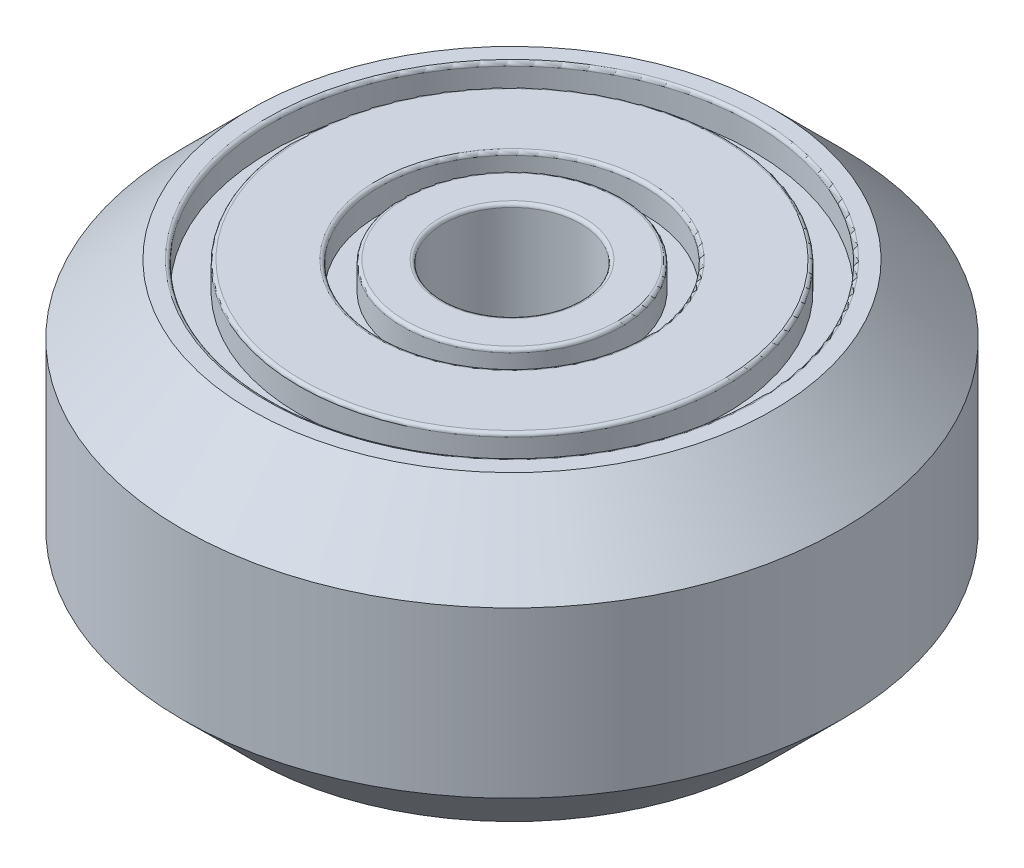
ISO-10303-21;
HEADER;
FILE_DESCRIPTION(('STEP AP214'),'2;1');
FILE_NAME('part.step','',(''),(''),'','','');
FILE_SCHEMA(('AUTOMOTIVE_DESIGN { 1 0 10303 214 1 1 1 1 }'));
ENDSEC;
DATA;
#1=APPLICATION_CONTEXT('core data for automotive mechanical design processes');
#2=APPLICATION_PROTOCOL_DEFINITION('international standard','automotive_design',2000,#1);
#3=PRODUCT_CONTEXT('',#1,'mechanical');
#4=PRODUCT('Part','Part','',(#3));
#5=PRODUCT_RELATED_PRODUCT_CATEGORY('part','',(#4));
#6=PRODUCT_DEFINITION_FORMATION('','',#4);
#7=PRODUCT_DEFINITION_CONTEXT('part definition',#1,'design');
#8=PRODUCT_DEFINITION('design','',#6,#7);
#9=PRODUCT_DEFINITION_SHAPE('','',#8);
#10=(LENGTH_UNIT() NAMED_UNIT(*) SI_UNIT(.MILLI.,.METRE.));
#11=(NAMED_UNIT(*) PLANE_ANGLE_UNIT() SI_UNIT($,.RADIAN.));
#12=(NAMED_UNIT(*) SI_UNIT($,.STERADIAN.) SOLID_ANGLE_UNIT());
#13=UNCERTAINTY_MEASURE_WITH_UNIT(LENGTH_MEASURE(1.E-05),#10,'distance_accuracy_value','');
#14=(GEOMETRIC_REPRESENTATION_CONTEXT(3) GLOBAL_UNCERTAINTY_ASSIGNED_CONTEXT((#13)) GLOBAL_UNIT_ASSIGNED_CONTEXT((#10,
#11,#12)) REPRESENTATION_CONTEXT('',''));
#15=CARTESIAN_POINT('',(0.,0.,0.));
#16=DIRECTION('',(0.,0.,1.));
#17=DIRECTION('',(1.,0.,0.));
#18=AXIS2_PLACEMENT_3D('',#15,#16,#17);
#19=CARTESIAN_POINT('',(0.,0.,0.));
#20=DIRECTION('',(0.,1.,0.));
#21=DIRECTION('',(0.,0.,-1.));
#22=AXIS2_PLACEMENT_3D('',#19,#20,#21);
#23=PLANE('',#22);
#24=CARTESIAN_POINT('',(0.,0.,0.));
#25=DIRECTION('',(0.,-1.,0.));
#26=DIRECTION('',(0.,0.,-1.));
#27=AXIS2_PLACEMENT_3D('',#24,#25,#26);
#28=CIRCLE('',#27,2.5);
#29=CARTESIAN_POINT('',(0.,0.,-2.5));
#30=VERTEX_POINT('',#29);
#31=EDGE_CURVE('E98',#30,#30,#28,.T.);
#32=ORIENTED_EDGE('',*,*,#31,.F.);
#33=EDGE_LOOP('',(#32));
#34=FACE_BOUND('',#33,.T.);
#35=CARTESIAN_POINT('',(0.,0.,0.));
#36=DIRECTION('',(0.,-1.,0.));
#37=DIRECTION('',(0.,0.,-1.));
#38=AXIS2_PLACEMENT_3D('',#35,#36,#37);
#39=CIRCLE('',#38,3.99081324353973);
#40=CARTESIAN_POINT('',(0.,0.,-3.99081324353973));
#41=VERTEX_POINT('',#40);
#42=EDGE_CURVE('E130',#41,#41,#39,.T.);
#43=ORIENTED_EDGE('',*,*,#42,.T.);
#44=EDGE_LOOP('',(#43));
#45=FACE_BOUND('',#44,.T.);
#46=ADVANCED_FACE('F48',(#34,#45),#23,.F.);
#47=CARTESIAN_POINT('',(0.,11.,0.));
#48=DIRECTION('',(0.,1.,0.));
#49=DIRECTION('',(0.,0.,-1.));
#50=AXIS2_PLACEMENT_3D('',#47,#48,#49);
#51=PLANE('',#50);
#52=CARTESIAN_POINT('',(0.,11.,0.));
#53=DIRECTION('',(0.,-1.,0.));
#54=DIRECTION('',(0.,0.,-1.));
#55=AXIS2_PLACEMENT_3D('',#52,#53,#54);
#56=CIRCLE('',#55,2.625);
#57=CARTESIAN_POINT('',(0.,11.,-2.625));
#58=VERTEX_POINT('',#57);
#59=EDGE_CURVE('E71',#58,#58,#56,.F.);
#60=ORIENTED_EDGE('',*,*,#59,.F.);
#61=EDGE_LOOP('',(#60));
#62=FACE_BOUND('',#61,.T.);
#63=CARTESIAN_POINT('',(0.,11.,0.));
#64=DIRECTION('',(0.,-1.,0.));
#65=DIRECTION('',(0.,0.,-1.));
#66=AXIS2_PLACEMENT_3D('',#63,#64,#65);
#67=CIRCLE('',#66,3.86581324353973);
#68=CARTESIAN_POINT('',(0.,11.,-3.86581324353973));
#69=VERTEX_POINT('',#68);
#70=EDGE_CURVE('E74',#69,#69,#67,.T.);
#71=ORIENTED_EDGE('',*,*,#70,.F.);
#72=EDGE_LOOP('',(#71));
#73=FACE_BOUND('',#72,.T.);
#74=ADVANCED_FACE('F175',(#62,#73),#51,.T.);
#75=CARTESIAN_POINT('',(0.,11.,0.));
#76=DIRECTION('',(0.,-1.,0.));
#77=DIRECTION('',(0.,0.,-1.));
#78=AXIS2_PLACEMENT_3D('',#75,#76,#77);
#79=CIRCLE('',#78,8.92068996697586);
#80=CARTESIAN_POINT('',(0.,11.,-8.92068996697586));
#81=VERTEX_POINT('',#80);
#82=EDGE_CURVE('E80',#81,#81,#79,.F.);
#83=ORIENTED_EDGE('',*,*,#82,.F.);
#84=EDGE_LOOP('',(#83));
#85=FACE_BOUND('',#84,.T.);
#86=CARTESIAN_POINT('',(0.,11.,0.));
#87=DIRECTION('',(0.,-1.,0.));
#88=DIRECTION('',(0.,0.,-1.));
#89=AXIS2_PLACEMENT_3D('',#86,#87,#88);
#90=CIRCLE('',#89,9.5);
#91=CARTESIAN_POINT('',(0.,11.,-9.5));
#92=VERTEX_POINT('',#91);
#93=EDGE_CURVE('E86',#92,#92,#90,.T.);
#94=ORIENTED_EDGE('',*,*,#93,.F.);
#95=EDGE_LOOP('',(#94));
#96=FACE_BOUND('',#95,.T.);
#97=ADVANCED_FACE('F180',(#85,#96),#51,.T.);
#98=CARTESIAN_POINT('',(0.,0.,0.));
#99=DIRECTION('',(0.,-1.,0.));
#100=DIRECTION('',(0.,0.,-1.));
#101=AXIS2_PLACEMENT_3D('',#98,#99,#100);
#102=CIRCLE('',#101,8.79568996697586);
#103=CARTESIAN_POINT('',(0.,0.,-8.79568996697586));
#104=VERTEX_POINT('',#103);
#105=EDGE_CURVE('E114',#104,#104,#102,.T.);
#106=ORIENTED_EDGE('',*,*,#105,.F.);
#107=EDGE_LOOP('',(#106));
#108=FACE_BOUND('',#107,.T.);
#109=CARTESIAN_POINT('',(0.,0.,0.));
#110=DIRECTION('',(0.,-1.,0.));
#111=DIRECTION('',(0.,0.,-1.));
#112=AXIS2_PLACEMENT_3D('',#109,#110,#111);
#113=CIRCLE('',#112,9.49999999999999);
#114=CARTESIAN_POINT('',(0.,0.,-9.49999999999999));
#115=VERTEX_POINT('',#114);
#116=EDGE_CURVE('E89',#115,#115,#113,.F.);
#117=ORIENTED_EDGE('',*,*,#116,.F.);
#118=EDGE_LOOP('',(#117));
#119=FACE_BOUND('',#118,.T.);
#120=ADVANCED_FACE('F158',(#108,#119),#23,.F.);
#121=CARTESIAN_POINT('',(0.,11.,0.));
#122=DIRECTION('',(0.,-1.,0.));
#123=DIRECTION('',(0.,0.,1.));
#124=AXIS2_PLACEMENT_3D('',#121,#122,#123);
#125=CYLINDRICAL_SURFACE('',#124,12.);
#126=CARTESIAN_POINT('',(0.,2.5,0.));
#127=DIRECTION('',(0.,-1.,0.));
#128=DIRECTION('',(0.,0.,-1.));
#129=AXIS2_PLACEMENT_3D('',#126,#127,#128);
#130=CIRCLE('',#129,12.);
#131=CARTESIAN_POINT('',(0.,2.5,-12.));
#132=VERTEX_POINT('',#131);
#133=EDGE_CURVE('E92',#132,#132,#130,.T.);
#134=ORIENTED_EDGE('',*,*,#133,.F.);
#135=EDGE_LOOP('',(#134));
#136=FACE_BOUND('',#135,.T.);
#137=CARTESIAN_POINT('',(0.,8.5,0.));
#138=DIRECTION('',(0.,-1.,0.));
#139=DIRECTION('',(0.,0.,-1.));
#140=AXIS2_PLACEMENT_3D('',#137,#138,#139);
#141=CIRCLE('',#140,12.);
#142=CARTESIAN_POINT('',(0.,8.5,-12.));
#143=VERTEX_POINT('',#142);
#144=EDGE_CURVE('E95',#143,#143,#141,.F.);
#145=ORIENTED_EDGE('',*,*,#144,.F.);
#146=EDGE_LOOP('',(#145));
#147=FACE_BOUND('',#146,.T.);
#148=ADVANCED_FACE('F188',(#136,#147),#125,.T.);
#149=CARTESIAN_POINT('',(0.,11.,0.));
#150=DIRECTION('',(0.,-1.,0.));
#151=DIRECTION('',(0.,0.,1.));
#152=AXIS2_PLACEMENT_3D('',#149,#150,#151);
#153=CYLINDRICAL_SURFACE('',#152,2.5);
#154=CARTESIAN_POINT('',(0.,10.875,0.));
#155=DIRECTION('',(0.,-1.,0.));
#156=DIRECTION('',(0.,0.,-1.));
#157=AXIS2_PLACEMENT_3D('',#154,#155,#156);
#158=CIRCLE('',#157,2.5);
#159=CARTESIAN_POINT('',(0.,10.875,-2.5));
#160=VERTEX_POINT('',#159);
#161=EDGE_CURVE('E77',#160,#160,#158,.T.);
#162=ORIENTED_EDGE('',*,*,#161,.F.);
#163=EDGE_LOOP('',(#162));
#164=FACE_BOUND('',#163,.T.);
#165=ORIENTED_EDGE('',*,*,#31,.T.);
#166=EDGE_LOOP('',(#165));
#167=FACE_BOUND('',#166,.T.);
#168=ADVANCED_FACE('F193',(#164,#167),#153,.F.);
#169=CARTESIAN_POINT('',(0.,10.,0.));
#170=DIRECTION('',(0.,1.,0.));
#171=DIRECTION('',(0.,0.,-1.));
#172=AXIS2_PLACEMENT_3D('',#169,#170,#171);
#173=CYLINDRICAL_SURFACE('',#172,7.7454866043456);
#174=CARTESIAN_POINT('',(0.,10.875,0.));
#175=DIRECTION('',(0.,-1.,0.));
#176=DIRECTION('',(0.,0.,-1.));
#177=AXIS2_PLACEMENT_3D('',#174,#175,#176);
#178=CIRCLE('',#177,7.7454866043456);
#179=CARTESIAN_POINT('',(0.,10.875,-7.7454866043456));
#180=VERTEX_POINT('',#179);
#181=EDGE_CURVE('E11',#180,#180,#178,.F.);
#182=ORIENTED_EDGE('',*,*,#181,.F.);
#183=EDGE_LOOP('',(#182));
#184=FACE_BOUND('',#183,.T.);
#185=CARTESIAN_POINT('',(0.,10.,0.));
#186=DIRECTION('',(0.,-1.,0.));
#187=DIRECTION('',(0.,0.,-1.));
#188=AXIS2_PLACEMENT_3D('',#185,#186,#187);
#189=CIRCLE('',#188,7.7454866043456);
#190=CARTESIAN_POINT('',(0.,10.,-7.7454866043456));
#191=VERTEX_POINT('',#190);
#192=EDGE_CURVE('E104',#191,#191,#189,.T.);
#193=ORIENTED_EDGE('',*,*,#192,.F.);
#194=EDGE_LOOP('',(#193));
#195=FACE_BOUND('',#194,.T.);
#196=ADVANCED_FACE('F259',(#184,#195),#173,.T.);
#197=CARTESIAN_POINT('',(0.,10.,0.));
#198=DIRECTION('',(0.,1.,0.));
#199=DIRECTION('',(0.,0.,-1.));
#200=AXIS2_PLACEMENT_3D('',#197,#198,#199);
#201=CYLINDRICAL_SURFACE('',#200,8.79568996697586);
#202=CARTESIAN_POINT('',(0.,10.875,0.));
#203=DIRECTION('',(0.,-1.,0.));
#204=DIRECTION('',(0.,0.,-1.));
#205=AXIS2_PLACEMENT_3D('',#202,#203,#204);
#206=CIRCLE('',#205,8.79568996697586);
#207=CARTESIAN_POINT('',(0.,10.875,-8.79568996697586));
#208=VERTEX_POINT('',#207);
#209=EDGE_CURVE('E83',#208,#208,#206,.T.);
#210=ORIENTED_EDGE('',*,*,#209,.F.);
#211=EDGE_LOOP('',(#210));
#212=FACE_BOUND('',#211,.T.);
#213=CARTESIAN_POINT('',(0.,10.,0.));
#214=DIRECTION('',(0.,-1.,0.));
#215=DIRECTION('',(0.,0.,-1.));
#216=AXIS2_PLACEMENT_3D('',#213,#214,#215);
#217=CIRCLE('',#216,8.79568996697586);
#218=CARTESIAN_POINT('',(0.,10.,-8.79568996697586));
#219=VERTEX_POINT('',#218);
#220=EDGE_CURVE('E101',#219,#219,#217,.T.);
#221=ORIENTED_EDGE('',*,*,#220,.T.);
#222=EDGE_LOOP('',(#221));
#223=FACE_BOUND('',#222,.T.);
#224=ADVANCED_FACE('F255',(#212,#223),#201,.F.);
#225=CARTESIAN_POINT('',(0.,10.,0.));
#226=DIRECTION('',(0.,1.,0.));
#227=DIRECTION('',(0.,0.,-1.));
#228=AXIS2_PLACEMENT_3D('',#225,#226,#227);
#229=PLANE('',#228);
#230=ORIENTED_EDGE('',*,*,#192,.T.);
#231=EDGE_LOOP('',(#230));
#232=FACE_BOUND('',#231,.T.);
#233=ORIENTED_EDGE('',*,*,#220,.F.);
#234=EDGE_LOOP('',(#233));
#235=FACE_BOUND('',#234,.T.);
#236=ADVANCED_FACE('F252',(#232,#235),#229,.T.);
#237=CARTESIAN_POINT('',(0.,11.,0.));
#238=DIRECTION('',(0.,-1.,0.));
#239=DIRECTION('',(0.,0.,-1.));
#240=AXIS2_PLACEMENT_3D('',#237,#238,#239);
#241=CIRCLE('',#240,4.94705703683497);
#242=CARTESIAN_POINT('',(0.,11.,-4.94705703683497));
#243=VERTEX_POINT('',#242);
#244=EDGE_CURVE('E55',#243,#243,#241,.F.);
#245=ORIENTED_EDGE('',*,*,#244,.F.);
#246=EDGE_LOOP('',(#245));
#247=FACE_BOUND('',#246,.T.);
#248=CARTESIAN_POINT('',(0.,11.,0.));
#249=DIRECTION('',(0.,-1.,0.));
#250=DIRECTION('',(0.,0.,-1.));
#251=AXIS2_PLACEMENT_3D('',#248,#249,#250);
#252=CIRCLE('',#251,7.6204866043456);
#253=CARTESIAN_POINT('',(0.,11.,-7.6204866043456));
#254=VERTEX_POINT('',#253);
#255=EDGE_CURVE('E59',#254,#254,#252,.T.);
#256=ORIENTED_EDGE('',*,*,#255,.F.);
#257=EDGE_LOOP('',(#256));
#258=FACE_BOUND('',#257,.T.);
#259=ADVANCED_FACE('F183',(#247,#258),#51,.T.);
#260=CARTESIAN_POINT('',(0.,10.,0.));
#261=DIRECTION('',(0.,1.,0.));
#262=DIRECTION('',(0.,0.,-1.));
#263=AXIS2_PLACEMENT_3D('',#260,#261,#262);
#264=CYLINDRICAL_SURFACE('',#263,3.99081324353973);
#265=CARTESIAN_POINT('',(0.,10.875,0.));
#266=DIRECTION('',(0.,-1.,0.));
#267=DIRECTION('',(0.,0.,-1.));
#268=AXIS2_PLACEMENT_3D('',#265,#266,#267);
#269=CIRCLE('',#268,3.99081324353973);
#270=CARTESIAN_POINT('',(0.,10.875,-3.99081324353973));
#271=VERTEX_POINT('',#270);
#272=EDGE_CURVE('E68',#271,#271,#269,.F.);
#273=ORIENTED_EDGE('',*,*,#272,.F.);
#274=EDGE_LOOP('',(#273));
#275=FACE_BOUND('',#274,.T.);
#276=CARTESIAN_POINT('',(0.,10.,0.));
#277=DIRECTION('',(0.,-1.,0.));
#278=DIRECTION('',(0.,0.,-1.));
#279=AXIS2_PLACEMENT_3D('',#276,#277,#278);
#280=CIRCLE('',#279,3.99081324353973);
#281=CARTESIAN_POINT('',(0.,10.,-3.99081324353973));
#282=VERTEX_POINT('',#281);
#283=EDGE_CURVE('E110',#282,#282,#280,.T.);
#284=ORIENTED_EDGE('',*,*,#283,.F.);
#285=EDGE_LOOP('',(#284));
#286=FACE_BOUND('',#285,.T.);
#287=ADVANCED_FACE('F239',(#275,#286),#264,.T.);
#288=CARTESIAN_POINT('',(0.,10.,0.));
#289=DIRECTION('',(0.,1.,0.));
#290=DIRECTION('',(0.,0.,-1.));
#291=AXIS2_PLACEMENT_3D('',#288,#289,#290);
#292=CYLINDRICAL_SURFACE('',#291,4.82205703683497);
#293=CARTESIAN_POINT('',(0.,10.875,0.));
#294=DIRECTION('',(0.,-1.,0.));
#295=DIRECTION('',(0.,0.,-1.));
#296=AXIS2_PLACEMENT_3D('',#293,#294,#295);
#297=CIRCLE('',#296,4.82205703683497);
#298=CARTESIAN_POINT('',(0.,10.875,-4.82205703683497));
#299=VERTEX_POINT('',#298);
#300=EDGE_CURVE('E63',#299,#299,#297,.T.);
#301=ORIENTED_EDGE('',*,*,#300,.F.);
#302=EDGE_LOOP('',(#301));
#303=FACE_BOUND('',#302,.T.);
#304=CARTESIAN_POINT('',(0.,10.,0.));
#305=DIRECTION('',(0.,-1.,0.));
#306=DIRECTION('',(0.,0.,-1.));
#307=AXIS2_PLACEMENT_3D('',#304,#305,#306);
#308=CIRCLE('',#307,4.82205703683497);
#309=CARTESIAN_POINT('',(0.,10.,-4.82205703683497));
#310=VERTEX_POINT('',#309);
#311=EDGE_CURVE('E107',#310,#310,#308,.T.);
#312=ORIENTED_EDGE('',*,*,#311,.T.);
#313=EDGE_LOOP('',(#312));
#314=FACE_BOUND('',#313,.T.);
#315=ADVANCED_FACE('F236',(#303,#314),#292,.F.);
#316=CARTESIAN_POINT('',(0.,10.,0.));
#317=DIRECTION('',(0.,1.,0.));
#318=DIRECTION('',(0.,0.,-1.));
#319=AXIS2_PLACEMENT_3D('',#316,#317,#318);
#320=PLANE('',#319);
#321=ORIENTED_EDGE('',*,*,#283,.T.);
#322=EDGE_LOOP('',(#321));
#323=FACE_BOUND('',#322,.T.);
#324=ORIENTED_EDGE('',*,*,#311,.F.);
#325=EDGE_LOOP('',(#324));
#326=FACE_BOUND('',#325,.T.);
#327=ADVANCED_FACE('F205',(#323,#326),#320,.T.);
#328=CARTESIAN_POINT('',(0.,2.5,0.));
#329=DIRECTION('',(0.,1.,0.));
#330=DIRECTION('',(0.,0.,-1.));
#331=AXIS2_PLACEMENT_3D('',#328,#329,#330);
#332=CONICAL_SURFACE('',#331,12.,0.78539816339745);
#333=ORIENTED_EDGE('',*,*,#116,.T.);
#334=EDGE_LOOP('',(#333));
#335=FACE_BOUND('',#334,.T.);
#336=ORIENTED_EDGE('',*,*,#133,.T.);
#337=EDGE_LOOP('',(#336));
#338=FACE_BOUND('',#337,.T.);
#339=ADVANCED_FACE('F201',(#335,#338),#332,.T.);
#340=CARTESIAN_POINT('',(0.,11.,0.));
#341=DIRECTION('',(0.,-1.,0.));
#342=DIRECTION('',(0.,0.,1.));
#343=AXIS2_PLACEMENT_3D('',#340,#341,#342);
#344=CONICAL_SURFACE('',#343,9.5,0.785398163397448);
#345=ORIENTED_EDGE('',*,*,#144,.T.);
#346=EDGE_LOOP('',(#345));
#347=FACE_BOUND('',#346,.T.);
#348=ORIENTED_EDGE('',*,*,#93,.T.);
#349=EDGE_LOOP('',(#348));
#350=FACE_BOUND('',#349,.T.);
#351=ADVANCED_FACE('F204',(#347,#350),#344,.T.);
#352=CARTESIAN_POINT('',(0.,10.875,0.));
#353=DIRECTION('',(0.,1.,0.));
#354=DIRECTION('',(0.,0.,-1.));
#355=AXIS2_PLACEMENT_3D('',#352,#353,#354);
#356=TOROIDAL_SURFACE('',#355,8.92068996697586,0.125);
#357=ORIENTED_EDGE('',*,*,#82,.T.);
#358=EDGE_LOOP('',(#357));
#359=FACE_BOUND('',#358,.T.);
#360=ORIENTED_EDGE('',*,*,#209,.T.);
#361=EDGE_LOOP('',(#360));
#362=FACE_BOUND('',#361,.T.);
#363=ADVANCED_FACE('F213',(#359,#362),#356,.T.);
#364=CARTESIAN_POINT('',(0.,10.875,0.));
#365=DIRECTION('',(0.,1.,0.));
#366=DIRECTION('',(0.,0.,-1.));
#367=AXIS2_PLACEMENT_3D('',#364,#365,#366);
#368=TOROIDAL_SURFACE('',#367,2.625,0.125);
#369=ORIENTED_EDGE('',*,*,#59,.T.);
#370=EDGE_LOOP('',(#369));
#371=FACE_BOUND('',#370,.T.);
#372=ORIENTED_EDGE('',*,*,#161,.T.);
#373=EDGE_LOOP('',(#372));
#374=FACE_BOUND('',#373,.T.);
#375=ADVANCED_FACE('F220',(#371,#374),#368,.T.);
#376=CARTESIAN_POINT('',(0.,10.875,0.));
#377=DIRECTION('',(0.,1.,0.));
#378=DIRECTION('',(0.,0.,-1.));
#379=AXIS2_PLACEMENT_3D('',#376,#377,#378);
#380=TOROIDAL_SURFACE('',#379,3.86581324353973,0.125);
#381=ORIENTED_EDGE('',*,*,#272,.T.);
#382=EDGE_LOOP('',(#381));
#383=FACE_BOUND('',#382,.T.);
#384=ORIENTED_EDGE('',*,*,#70,.T.);
#385=EDGE_LOOP('',(#384));
#386=FACE_BOUND('',#385,.T.);
#387=ADVANCED_FACE('F226',(#383,#386),#380,.T.);
#388=CARTESIAN_POINT('',(0.,10.875,0.));
#389=DIRECTION('',(0.,1.,0.));
#390=DIRECTION('',(0.,0.,-1.));
#391=AXIS2_PLACEMENT_3D('',#388,#389,#390);
#392=TOROIDAL_SURFACE('',#391,4.94705703683497,0.125);
#393=ORIENTED_EDGE('',*,*,#244,.T.);
#394=EDGE_LOOP('',(#393));
#395=FACE_BOUND('',#394,.T.);
#396=ORIENTED_EDGE('',*,*,#300,.T.);
#397=EDGE_LOOP('',(#396));
#398=FACE_BOUND('',#397,.T.);
#399=ADVANCED_FACE('F172',(#395,#398),#392,.T.);
#400=CARTESIAN_POINT('',(0.,10.875,0.));
#401=DIRECTION('',(0.,1.,0.));
#402=DIRECTION('',(0.,0.,-1.));
#403=AXIS2_PLACEMENT_3D('',#400,#401,#402);
#404=TOROIDAL_SURFACE('',#403,7.6204866043456,0.125);
#405=ORIENTED_EDGE('',*,*,#181,.T.);
#406=EDGE_LOOP('',(#405));
#407=FACE_BOUND('',#406,.T.);
#408=ORIENTED_EDGE('',*,*,#255,.T.);
#409=EDGE_LOOP('',(#408));
#410=FACE_BOUND('',#409,.T.);
#411=ADVANCED_FACE('F50',(#407,#410),#404,.T.);
#412=CARTESIAN_POINT('',(0.,1.,0.));
#413=DIRECTION('',(0.,-1.,0.));
#414=DIRECTION('',(0.,0.,1.));
#415=AXIS2_PLACEMENT_3D('',#412,#413,#414);
#416=CYLINDRICAL_SURFACE('',#415,7.7454866043456);
#417=CARTESIAN_POINT('',(0.,1.,0.));
#418=DIRECTION('',(0.,-1.,0.));
#419=DIRECTION('',(0.,0.,-1.));
#420=AXIS2_PLACEMENT_3D('',#417,#418,#419);
#421=CIRCLE('',#420,7.7454866043456);
#422=CARTESIAN_POINT('',(0.,1.,-7.7454866043456));
#423=VERTEX_POINT('',#422);
#424=EDGE_CURVE('E117',#423,#423,#421,.T.);
#425=ORIENTED_EDGE('',*,*,#424,.T.);
#426=EDGE_LOOP('',(#425));
#427=FACE_BOUND('',#426,.T.);
#428=CARTESIAN_POINT('',(0.,0.,0.));
#429=DIRECTION('',(0.,-1.,0.));
#430=DIRECTION('',(0.,0.,-1.));
#431=AXIS2_PLACEMENT_3D('',#428,#429,#430);
#432=CIRCLE('',#431,7.7454866043456);
#433=CARTESIAN_POINT('',(0.,0.,-7.7454866043456));
#434=VERTEX_POINT('',#433);
#435=EDGE_CURVE('E118',#434,#434,#432,.T.);
#436=ORIENTED_EDGE('',*,*,#435,.F.);
#437=EDGE_LOOP('',(#436));
#438=FACE_BOUND('',#437,.T.);
#439=ADVANCED_FACE('F161',(#427,#438),#416,.T.);
#440=CARTESIAN_POINT('',(0.,1.,0.));
#441=DIRECTION('',(0.,-1.,0.));
#442=DIRECTION('',(0.,0.,1.));
#443=AXIS2_PLACEMENT_3D('',#440,#441,#442);
#444=CYLINDRICAL_SURFACE('',#443,8.79568996697586);
#445=CARTESIAN_POINT('',(0.,1.,0.));
#446=DIRECTION('',(0.,-1.,0.));
#447=DIRECTION('',(0.,0.,-1.));
#448=AXIS2_PLACEMENT_3D('',#445,#446,#447);
#449=CIRCLE('',#448,8.79568996697586);
#450=CARTESIAN_POINT('',(0.,1.,-8.79568996697586));
#451=VERTEX_POINT('',#450);
#452=EDGE_CURVE('E113',#451,#451,#449,.T.);
#453=ORIENTED_EDGE('',*,*,#452,.F.);
#454=EDGE_LOOP('',(#453));
#455=FACE_BOUND('',#454,.T.);
#456=ORIENTED_EDGE('',*,*,#105,.T.);
#457=EDGE_LOOP('',(#456));
#458=FACE_BOUND('',#457,.T.);
#459=ADVANCED_FACE('F163',(#455,#458),#444,.F.);
#460=CARTESIAN_POINT('',(0.,1.,0.));
#461=DIRECTION('',(0.,-1.,0.));
#462=DIRECTION('',(0.,0.,-1.));
#463=AXIS2_PLACEMENT_3D('',#460,#461,#462);
#464=PLANE('',#463);
#465=ORIENTED_EDGE('',*,*,#424,.F.);
#466=EDGE_LOOP('',(#465));
#467=FACE_BOUND('',#466,.T.);
#468=ORIENTED_EDGE('',*,*,#452,.T.);
#469=EDGE_LOOP('',(#468));
#470=FACE_BOUND('',#469,.T.);
#471=ADVANCED_FACE('F156',(#467,#470),#464,.T.);
#472=CARTESIAN_POINT('',(0.,0.,0.));
#473=DIRECTION('',(0.,-1.,0.));
#474=DIRECTION('',(0.,0.,-1.));
#475=AXIS2_PLACEMENT_3D('',#472,#473,#474);
#476=CIRCLE('',#475,4.82205703683497);
#477=CARTESIAN_POINT('',(0.,0.,-4.82205703683497));
#478=VERTEX_POINT('',#477);
#479=EDGE_CURVE('E126',#478,#478,#476,.T.);
#480=ORIENTED_EDGE('',*,*,#479,.F.);
#481=EDGE_LOOP('',(#480));
#482=FACE_BOUND('',#481,.T.);
#483=ORIENTED_EDGE('',*,*,#435,.T.);
#484=EDGE_LOOP('',(#483));
#485=FACE_BOUND('',#484,.T.);
#486=ADVANCED_FACE('F153',(#482,#485),#23,.F.);
#487=CARTESIAN_POINT('',(0.,1.,0.));
#488=DIRECTION('',(0.,-1.,0.));
#489=DIRECTION('',(0.,0.,1.));
#490=AXIS2_PLACEMENT_3D('',#487,#488,#489);
#491=CYLINDRICAL_SURFACE('',#490,3.99081324353973);
#492=CARTESIAN_POINT('',(0.,1.,0.));
#493=DIRECTION('',(0.,-1.,0.));
#494=DIRECTION('',(0.,0.,-1.));
#495=AXIS2_PLACEMENT_3D('',#492,#493,#494);
#496=CIRCLE('',#495,3.99081324353973);
#497=CARTESIAN_POINT('',(0.,1.,-3.99081324353973));
#498=VERTEX_POINT('',#497);
#499=EDGE_CURVE('E129',#498,#498,#496,.T.);
#500=ORIENTED_EDGE('',*,*,#499,.T.);
#501=EDGE_LOOP('',(#500));
#502=FACE_BOUND('',#501,.T.);
#503=ORIENTED_EDGE('',*,*,#42,.F.);
#504=EDGE_LOOP('',(#503));
#505=FACE_BOUND('',#504,.T.);
#506=ADVANCED_FACE('F138',(#502,#505),#491,.T.);
#507=CARTESIAN_POINT('',(0.,1.,0.));
#508=DIRECTION('',(0.,-1.,0.));
#509=DIRECTION('',(0.,0.,1.));
#510=AXIS2_PLACEMENT_3D('',#507,#508,#509);
#511=CYLINDRICAL_SURFACE('',#510,4.82205703683497);
#512=CARTESIAN_POINT('',(0.,1.,0.));
#513=DIRECTION('',(0.,-1.,0.));
#514=DIRECTION('',(0.,0.,-1.));
#515=AXIS2_PLACEMENT_3D('',#512,#513,#514);
#516=CIRCLE('',#515,4.82205703683497);
#517=CARTESIAN_POINT('',(0.,1.,-4.82205703683497));
#518=VERTEX_POINT('',#517);
#519=EDGE_CURVE('E121',#518,#518,#516,.T.);
#520=ORIENTED_EDGE('',*,*,#519,.F.);
#521=EDGE_LOOP('',(#520));
#522=FACE_BOUND('',#521,.T.);
#523=ORIENTED_EDGE('',*,*,#479,.T.);
#524=EDGE_LOOP('',(#523));
#525=FACE_BOUND('',#524,.T.);
#526=ADVANCED_FACE('F144',(#522,#525),#511,.F.);
#527=CARTESIAN_POINT('',(0.,1.,0.));
#528=DIRECTION('',(0.,-1.,0.));
#529=DIRECTION('',(0.,0.,-1.));
#530=AXIS2_PLACEMENT_3D('',#527,#528,#529);
#531=PLANE('',#530);
#532=ORIENTED_EDGE('',*,*,#499,.F.);
#533=EDGE_LOOP('',(#532));
#534=FACE_BOUND('',#533,.T.);
#535=ORIENTED_EDGE('',*,*,#519,.T.);
#536=EDGE_LOOP('',(#535));
#537=FACE_BOUND('',#536,.T.);
#538=ADVANCED_FACE('F141',(#534,#537),#531,.T.);
#539=CLOSED_SHELL('',(#46,#74,#97,#120,#148,#168,#196,#224,#236,#259,#287,#315,#327,#339,#351,
#363,#375,#387,#399,#411,#439,#459,#471,#486,#506,#526,#538));
#540=MANIFOLD_SOLID_BREP('B2',#539);
#541=ADVANCED_BREP_SHAPE_REPRESENTATION('',(#18,#540),#14);
#542=SHAPE_DEFINITION_REPRESENTATION(#9,#541);
ENDSEC;
END-ISO-10303-21;
